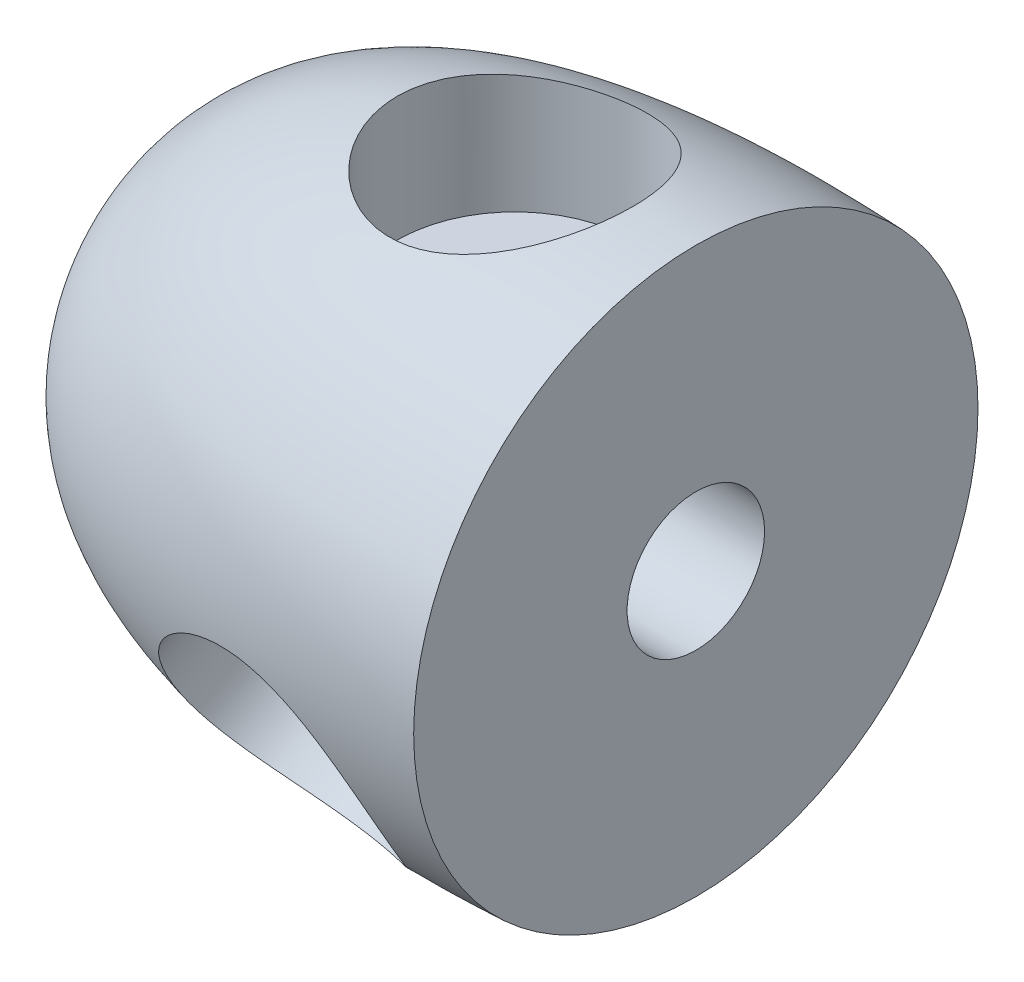
ISO-10303-21;
HEADER;
FILE_DESCRIPTION(('STEP AP214'),'2;1');
FILE_NAME('part.step','',(''),(''),'','','');
FILE_SCHEMA(('AUTOMOTIVE_DESIGN { 1 0 10303 214 1 1 1 1 }'));
ENDSEC;
DATA;
#1=APPLICATION_CONTEXT('core data for automotive mechanical design processes');
#2=APPLICATION_PROTOCOL_DEFINITION('international standard','automotive_design',2000,#1);
#3=PRODUCT_CONTEXT('',#1,'mechanical');
#4=PRODUCT('Part','Part','',(#3));
#5=PRODUCT_RELATED_PRODUCT_CATEGORY('part','',(#4));
#6=PRODUCT_DEFINITION_FORMATION('','',#4);
#7=PRODUCT_DEFINITION_CONTEXT('part definition',#1,'design');
#8=PRODUCT_DEFINITION('design','',#6,#7);
#9=PRODUCT_DEFINITION_SHAPE('','',#8);
#10=(LENGTH_UNIT() NAMED_UNIT(*) SI_UNIT(.MILLI.,.METRE.));
#11=(NAMED_UNIT(*) PLANE_ANGLE_UNIT() SI_UNIT($,.RADIAN.));
#12=(NAMED_UNIT(*) SI_UNIT($,.STERADIAN.) SOLID_ANGLE_UNIT());
#13=UNCERTAINTY_MEASURE_WITH_UNIT(LENGTH_MEASURE(1.E-05),#10,'distance_accuracy_value','');
#14=(GEOMETRIC_REPRESENTATION_CONTEXT(3) GLOBAL_UNCERTAINTY_ASSIGNED_CONTEXT((#13)) GLOBAL_UNIT_ASSIGNED_CONTEXT((#10,
#11,#12)) REPRESENTATION_CONTEXT('',''));
#15=CARTESIAN_POINT('',(0.,0.,0.));
#16=DIRECTION('',(0.,0.,1.));
#17=DIRECTION('',(1.,0.,0.));
#18=AXIS2_PLACEMENT_3D('',#15,#16,#17);
#19=CARTESIAN_POINT('',(38.1,19.812,0.));
#20=CARTESIAN_POINT('',(0.,21.4716402726946,0.));
#21=CARTESIAN_POINT('',(0.,0.,0.));
#22=B_SPLINE_CURVE_WITH_KNOTS('',2,(#19,#20,#21),.UNSPECIFIED.,.F.,.F.,(3,3),(0.,1.),.UNSPECIFIED.);
#23=CARTESIAN_POINT('',(0.,0.,0.));
#24=DIRECTION('',(-1.,0.,0.));
#25=AXIS1_PLACEMENT('',#23,#24);
#26=SURFACE_OF_REVOLUTION('',#22,#25);
#27=CARTESIAN_POINT('',(25.4,-1.76261734986766,-19.562942804273));
#28=CARTESIAN_POINT('',(25.177979042256,-1.75245092378135,-19.545334639338));
#29=CARTESIAN_POINT('',(24.9556856985046,-1.75155722758257,-19.5258587901368));
#30=CARTESIAN_POINT('',(24.5121644801844,-1.76840001050465,-19.4832226921928));
#31=CARTESIAN_POINT('',(24.2909365653041,-1.7861357791105,-19.4600625839937));
#32=CARTESIAN_POINT('',(23.851173876926,-1.8400757437532,-19.4100264242823));
#33=CARTESIAN_POINT('',(23.6326390650033,-1.8762796759748,-19.383150425855));
#34=CARTESIAN_POINT('',(23.1998549445183,-1.96675266852705,-19.3255712201423));
#35=CARTESIAN_POINT('',(22.9856056932079,-2.02102197002643,-19.2948679617673));
#36=CARTESIAN_POINT('',(22.563147708966,-2.14693709527098,-19.229488670206));
#37=CARTESIAN_POINT('',(22.3549330010919,-2.21856502450286,-19.1948167475011));
#38=CARTESIAN_POINT('',(21.9457548185982,-2.3784181937859,-19.1212410053601));
#39=CARTESIAN_POINT('',(21.7447913323496,-2.46664340721787,-19.0823371927112));
#40=CARTESIAN_POINT('',(21.3514508543389,-2.65873565988601,-19.0000256115136));
#41=CARTESIAN_POINT('',(21.1590738869654,-2.76260274354651,-18.9566178301732));
#42=CARTESIAN_POINT('',(20.7840716970498,-2.98494989831165,-18.8649909367234));
#43=CARTESIAN_POINT('',(20.6014500064428,-3.10343521130188,-18.8167700999125));
#44=CARTESIAN_POINT('',(20.2436390991279,-3.35633250972562,-18.7142271397298));
#45=CARTESIAN_POINT('',(20.0686699358216,-3.49101438272354,-18.6598027458739));
#46=CARTESIAN_POINT('',(19.7312350472181,-3.77307197207505,-18.5453681739561));
#47=CARTESIAN_POINT('',(19.5687696000923,-3.92044797068136,-18.4853578716896));
#48=CARTESIAN_POINT('',(19.2573255038571,-4.22660350531439,-18.3594863967184));
#49=CARTESIAN_POINT('',(19.1083504494912,-4.3853860607164,-18.293623673746));
#50=CARTESIAN_POINT('',(18.8249304290291,-4.71289597032143,-18.1558957268127));
#51=CARTESIAN_POINT('',(18.6904807401799,-4.88162006440834,-18.084032467411));
#52=CARTESIAN_POINT('',(18.433189915827,-5.23276429722652,-17.9319635837839));
#53=CARTESIAN_POINT('',(18.3108076146885,-5.4154415176934,-17.8515745296494));
#54=CARTESIAN_POINT('',(18.0831804365436,-5.78834152211271,-17.6842810555326));
#55=CARTESIAN_POINT('',(17.9779359169472,-5.97856446332896,-17.5973764997241));
#56=CARTESIAN_POINT('',(17.7853708906434,-6.36494915577863,-17.4171651267974));
#57=CARTESIAN_POINT('',(17.6980495891138,-6.56111064321866,-17.3238585938259));
#58=CARTESIAN_POINT('',(17.5420014283773,-6.95775535589853,-17.1310852675636));
#59=CARTESIAN_POINT('',(17.4732742688919,-7.1582385112909,-17.0316185737856));
#60=CARTESIAN_POINT('',(17.3555004393737,-7.56006128711307,-16.8278407979884));
#61=CARTESIAN_POINT('',(17.3062810933601,-7.76137668863923,-16.7235817750804));
#62=CARTESIAN_POINT('',(17.2270409904684,-8.16505394391144,-16.5099163007125));
#63=CARTESIAN_POINT('',(17.1970201622881,-8.36741579376823,-16.4005098683715));
#64=CARTESIAN_POINT('',(17.1564287140397,-8.7715938667887,-16.1772225670535));
#65=CARTESIAN_POINT('',(17.1458560490923,-8.97341014508818,-16.0633421697782));
#66=CARTESIAN_POINT('',(17.1442438498728,-9.37499195420002,-15.831890321555));
#67=CARTESIAN_POINT('',(17.1532040708587,-9.57475751067589,-15.7143189168727));
#68=CARTESIAN_POINT('',(17.1902286178592,-9.96704836192916,-15.4786429635141));
#69=CARTESIAN_POINT('',(17.2179298451381,-10.1596391573758,-15.3605901899593));
#70=CARTESIAN_POINT('',(17.2918396297032,-10.5401535796863,-15.1227764963873));
#71=CARTESIAN_POINT('',(17.3380479272483,-10.7280772720121,-15.003015600366));
#72=CARTESIAN_POINT('',(17.448610461299,-11.0980732117455,-14.7628293578434));
#73=CARTESIAN_POINT('',(17.5129650804278,-11.2801453356801,-14.6424039973841));
#74=CARTESIAN_POINT('',(17.6593300820117,-11.6373588381103,-14.4020059699722));
#75=CARTESIAN_POINT('',(17.7413406567789,-11.8125001410895,-14.282033307965));
#76=CARTESIAN_POINT('',(17.9229253698379,-12.155856560836,-14.0430403485334));
#77=CARTESIAN_POINT('',(18.0225958773169,-12.3240270858483,-13.9240292275634));
#78=CARTESIAN_POINT('',(18.2385107562761,-12.6515923632142,-13.6888399535874));
#79=CARTESIAN_POINT('',(18.3547612961594,-12.8109838186892,-13.572662873875));
#80=CARTESIAN_POINT('',(18.6029780816215,-13.1201418189478,-13.3444844017514));
#81=CARTESIAN_POINT('',(18.7349402946533,-13.269910818296,-13.2324819475324));
#82=CARTESIAN_POINT('',(19.0137923162863,-13.559296126781,-13.013861180692));
#83=CARTESIAN_POINT('',(19.1606889887665,-13.6989077165382,-12.9072453777809));
#84=CARTESIAN_POINT('',(19.4716117899571,-13.9701461779061,-12.6986089598378));
#85=CARTESIAN_POINT('',(19.635930507394,-14.1015467542589,-12.5967299276016));
#86=CARTESIAN_POINT('',(19.9779103809167,-14.3525576926407,-12.4014309229773));
#87=CARTESIAN_POINT('',(20.1555654803069,-14.472173350376,-12.3080071526578));
#88=CARTESIAN_POINT('',(20.5231792840938,-14.6992977765283,-12.1308956280198));
#89=CARTESIAN_POINT('',(20.7131432199534,-14.8068013432306,-12.0472120562656));
#90=CARTESIAN_POINT('',(21.1039350474311,-15.0092225760039,-11.890983926701));
#91=CARTESIAN_POINT('',(21.3047584172584,-15.1041454246353,-11.818434780165));
#92=CARTESIAN_POINT('',(21.7148381268812,-15.280657934292,-11.6860293185806));
#93=CARTESIAN_POINT('',(21.9240439281536,-15.3623158312335,-11.6261075407514));
#94=CARTESIAN_POINT('',(22.3503722968931,-15.5126291606077,-11.5195713736177));
#95=CARTESIAN_POINT('',(22.567494848128,-15.5812846196979,-11.4729569570303));
#96=CARTESIAN_POINT('',(23.0079578599879,-15.7053459703705,-11.3939731704966));
#97=CARTESIAN_POINT('',(23.2312964419457,-15.7607558176464,-11.3615995452217));
#98=CARTESIAN_POINT('',(23.6825128764926,-15.8581767555394,-11.3117796573715));
#99=CARTESIAN_POINT('',(23.9103905747733,-15.9001883008125,-11.2943328882366));
#100=CARTESIAN_POINT('',(24.3602849287699,-15.969378814711,-11.2751640268113));
#101=CARTESIAN_POINT('',(24.5822015136917,-15.9970543084529,-11.272877555943));
#102=CARTESIAN_POINT('',(25.0269222093978,-16.03984008856,-11.2826619023484));
#103=CARTESIAN_POINT('',(25.249726295955,-16.0549507155909,-11.2947323303484));
#104=CARTESIAN_POINT('',(25.6945974094742,-16.072611774355,-11.3330998688252));
#105=CARTESIAN_POINT('',(25.9166644487962,-16.0751624177903,-11.3593967395031));
#106=CARTESIAN_POINT('',(26.3585024155309,-16.0677551351911,-11.4258396994693));
#107=CARTESIAN_POINT('',(26.5782733196919,-16.0577970826115,-11.4659859288626));
#108=CARTESIAN_POINT('',(27.0127583032502,-16.025554424412,-11.5592555161112));
#109=CARTESIAN_POINT('',(27.227494527572,-16.0033426897499,-11.6123011301262));
#110=CARTESIAN_POINT('',(27.6518910424277,-15.9467551533038,-11.7307222844201));
#111=CARTESIAN_POINT('',(27.8615513783628,-15.9123794603629,-11.7960977143691));
#112=CARTESIAN_POINT('',(28.2745902648246,-15.8315799969881,-11.9382886679161));
#113=CARTESIAN_POINT('',(28.4779686133428,-15.7851558395647,-12.0151045589409));
#114=CARTESIAN_POINT('',(28.8773435818745,-15.6803889158321,-12.1791757898933));
#115=CARTESIAN_POINT('',(29.0733373073107,-15.622041532329,-12.2664351685556));
#116=CARTESIAN_POINT('',(29.6686586756022,-15.4225744743676,-12.5519071231717));
#117=CARTESIAN_POINT('',(30.0537727731701,-15.2611515664173,-12.7663251755798));
#118=CARTESIAN_POINT('',(30.7778849195124,-14.8871033316191,-13.2263520264475));
#119=CARTESIAN_POINT('',(31.1168675945177,-14.674461000451,-13.4719711705222));
#120=CARTESIAN_POINT('',(31.5912576772834,-14.3134397945528,-13.8608806369056));
#121=CARTESIAN_POINT('',(31.746537358285,-14.1829105717422,-13.9969810404419));
#122=CARTESIAN_POINT('',(32.041206730943,-13.908752795553,-14.2730742939618));
#123=CARTESIAN_POINT('',(32.1806026437289,-13.7651294106615,-14.4130655931054));
#124=CARTESIAN_POINT('',(32.4424224027067,-13.4652200588828,-14.6953613343857));
#125=CARTESIAN_POINT('',(32.56484500124,-13.3089331624744,-14.8376659457091));
#126=CARTESIAN_POINT('',(32.7916304557357,-12.9843296915883,-15.1229565200745));
#127=CARTESIAN_POINT('',(32.8959941747846,-12.81601369256,-15.2659424502184));
#128=CARTESIAN_POINT('',(33.0826495991738,-12.4736661580074,-15.5464666145238));
#129=CARTESIAN_POINT('',(33.1655330701112,-12.2999817282643,-15.6840345613557));
#130=CARTESIAN_POINT('',(33.3125654443824,-11.9430707016097,-15.9568012978342));
#131=CARTESIAN_POINT('',(33.3767146195439,-11.759844243195,-16.0920001218291));
#132=CARTESIAN_POINT('',(33.4855534247756,-11.3851141497414,-16.3585359083));
#133=CARTESIAN_POINT('',(33.5302515655465,-11.193614175138,-16.4898745362814));
#134=CARTESIAN_POINT('',(33.5997085881312,-10.8036612026647,-16.747396912131));
#135=CARTESIAN_POINT('',(33.6244686585947,-10.6052086200254,-16.873580966874));
#136=CARTESIAN_POINT('',(33.6527626580679,-10.2165937400664,-17.1112199020232));
#137=CARTESIAN_POINT('',(33.6576228200599,-10.0267825740606,-17.2230932497639));
#138=CARTESIAN_POINT('',(33.6497153600493,-9.6438984767207,-17.4404379120301));
#139=CARTESIAN_POINT('',(33.6369486318703,-9.45082571126596,-17.5459095508901));
#140=CARTESIAN_POINT('',(33.5939255781888,-9.06290786367979,-17.7497324366376));
#141=CARTESIAN_POINT('',(33.5636709171288,-8.8680629519521,-17.8480843601535));
#142=CARTESIAN_POINT('',(33.4859859329276,-8.47808832665189,-18.037136481541));
#143=CARTESIAN_POINT('',(33.4385554952877,-8.28295861118943,-18.1278366283988));
#144=CARTESIAN_POINT('',(33.328033612239,-7.89756332745035,-18.2995894485187));
#145=CARTESIAN_POINT('',(33.2652516357638,-7.70727503762213,-18.3807908205454));
#146=CARTESIAN_POINT('',(33.1241400998997,-7.32919564673703,-18.5353002889781));
#147=CARTESIAN_POINT('',(33.0458050283002,-7.14140545628733,-18.6086055726629));
#148=CARTESIAN_POINT('',(32.8742735995475,-6.76976837926926,-18.7472229391074));
#149=CARTESIAN_POINT('',(32.7810805704607,-6.5859206200649,-18.8125368061051));
#150=CARTESIAN_POINT('',(32.5804973053079,-6.22332504512482,-18.9352890823606));
#151=CARTESIAN_POINT('',(32.4731015907962,-6.04457922989086,-18.9927244351094));
#152=CARTESIAN_POINT('',(32.2392034402904,-5.68471207620167,-19.1025406150834));
#153=CARTESIAN_POINT('',(32.1120158789283,-5.50391565331918,-19.1545273409411));
#154=CARTESIAN_POINT('',(31.8436835347237,-5.15058556003674,-19.2503166389402));
#155=CARTESIAN_POINT('',(31.7025325140508,-4.97805563404017,-19.2941155278906));
#156=CARTESIAN_POINT('',(31.4071992012736,-4.64256748168071,-19.3738924915253));
#157=CARTESIAN_POINT('',(31.2530150278201,-4.47961064297724,-19.4098694344168));
#158=CARTESIAN_POINT('',(30.9325398519229,-4.16449239836816,-19.4744325708079));
#159=CARTESIAN_POINT('',(30.7662484154701,-4.01233137984678,-19.5030184991945));
#160=CARTESIAN_POINT('',(30.4115982239453,-3.71071485645264,-19.5548577279195));
#161=CARTESIAN_POINT('',(30.2225089624541,-3.56203937123997,-19.5776593119737));
#162=CARTESIAN_POINT('',(29.8328953705201,-3.2796221870867,-19.6160077441674));
#163=CARTESIAN_POINT('',(29.6323750104448,-3.14587535014364,-19.6315570942059));
#164=CARTESIAN_POINT('',(29.2209576801007,-2.8945291318709,-19.6559923835115));
#165=CARTESIAN_POINT('',(29.0100567912014,-2.77693591299748,-19.6648757855164));
#166=CARTESIAN_POINT('',(28.579334549032,-2.55928440232588,-19.6765172848787));
#167=CARTESIAN_POINT('',(28.3595171064493,-2.45921852351176,-19.6792780385968));
#168=CARTESIAN_POINT('',(27.9181892304072,-2.28015592170019,-19.6791899384302));
#169=CARTESIAN_POINT('',(27.6968758266825,-2.2006737481342,-19.6764868965596));
#170=CARTESIAN_POINT('',(27.2484993003996,-2.0604223245347,-19.6661735177426));
#171=CARTESIAN_POINT('',(27.0214362523287,-1.99965283221044,-19.6585632443388));
#172=CARTESIAN_POINT('',(26.5632454938914,-1.89770122524741,-19.6387810444158));
#173=CARTESIAN_POINT('',(26.3321195937261,-1.85651060569079,-19.6266111026989));
#174=CARTESIAN_POINT('',(25.8674297983361,-1.79432352451245,-19.59796567658));
#175=CARTESIAN_POINT('',(25.6338660119059,-1.77332616559523,-19.5814903835295));
#176=CARTESIAN_POINT('',(25.4,-1.76261734986766,-19.562942804273));
#177=B_SPLINE_CURVE_WITH_KNOTS('',3,(#27,#28,#29,#30,#31,#32,#33,#34,#35,#36,#37,#38,#39,#40,
#41,#42,#43,#44,#45,#46,#47,#48,#49,#50,#51,#52,#53,#54,#55,#56,#57,#58,#59,#60,#61,#62,#63,#64,
#65,#66,#67,#68,#69,#70,#71,#72,#73,#74,#75,#76,#77,#78,#79,#80,#81,#82,#83,#84,#85,#86,#87,#88,
#89,#90,#91,#92,#93,#94,#95,#96,#97,#98,#99,#100,#101,#102,#103,#104,#105,#106,#107,#108,#109,
#110,#111,#112,#113,#114,#115,#116,#117,#118,#119,#120,#121,#122,#123,#124,#125,#126,#127,#128,
#129,#130,#131,#132,#133,#134,#135,#136,#137,#138,#139,#140,#141,#142,#143,#144,#145,#146,#147,
#148,#149,#150,#151,#152,#153,#154,#155,#156,#157,#158,#159,#160,#161,#162,#163,#164,#165,#166,
#167,#168,#169,#170,#171,#172,#173,#174,#175,#176),.UNSPECIFIED.,.T.,.F.,(4,2,2,2,2,2,2,2,2,2,2,
2,2,2,2,2,2,2,2,2,2,2,2,2,2,2,2,2,2,2,2,2,2,2,2,2,2,2,2,2,2,2,2,2,2,2,2,2,2,2,2,2,2,2,2,2,2,2,2,
2,2,2,2,2,2,2,2,2,2,2,2,2,2,2,4),(0.,0.668639836207739,1.33725417187646,2.00585895674656,
2.67447266770232,3.34240003408516,4.01032632923638,4.67825452139495,5.3464229228862,
6.02788001843236,6.70935227002809,7.39100558035394,8.0724365877904,8.77394808707399,
9.47547421456755,10.176969225488,10.8784529072241,11.5735806856533,12.2687058824,
12.9637579859505,13.6588013807287,14.3407502649867,15.0226895786327,15.7046432723447,
16.3866043944047,17.072408474239,17.7584683680944,18.4443525563447,19.1305534144538,
19.8310178740593,20.5311661213272,21.2316139204666,21.9317722709881,22.628206352774,
23.3246390067136,24.0208634161743,24.7170641975443,25.3871942603012,26.0573061535259,
26.7274067517917,27.3975141292406,28.0636787694936,28.7298374490527,29.3960175278793,
30.0624560712645,31.4641017977987,32.8662134991787,33.5982952260125,34.3300892286367,
35.0619369948048,35.7937497741719,36.5025079922646,37.211255926024,37.9196934381761,
38.6280887122165,39.2884183636771,39.9487145324002,40.6089478667041,41.2691856023982,
41.9170760540844,42.5651965374249,43.2131720502784,43.8613982417635,44.5419027300032,
45.2227126015004,45.9036209169858,46.5845536530228,47.3085605410606,48.0323174738,
48.7563497508658,49.4800678391665,50.1847271202849,50.8893772771315,51.5937210587795,
52.2980335411878),.UNSPECIFIED.);
#178=CARTESIAN_POINT('',(25.4,-1.76261734986766,-19.562942804273));
#179=VERTEX_POINT('',#178);
#180=EDGE_CURVE('E39',#179,#179,#177,.T.);
#181=ORIENTED_EDGE('',*,*,#180,.T.);
#182=EDGE_LOOP('',(#181));
#183=FACE_BOUND('',#182,.T.);
#184=CARTESIAN_POINT('',(25.4,-16.0606967663486,11.3079428042732));
#185=CARTESIAN_POINT('',(25.177979042256,-16.0505308612439,11.2903343385492));
#186=CARTESIAN_POINT('',(24.9556856985046,-16.0341111291748,11.2798224503372));
#187=CARTESIAN_POINT('',(24.5121644801844,-15.988765793776,11.2730906792462));
#188=CARTESIAN_POINT('',(24.2909365653041,-15.9598406674183,11.2768702513149));
#189=CARTESIAN_POINT('',(23.851173876926,-15.889538099679,11.298565551119));
#190=CARTESIAN_POINT('',(23.6326390650033,-15.8481608361781,11.3164810769262));
#191=CARTESIAN_POINT('',(23.1998549445184,-15.7530592850251,11.3660433839765));
#192=CARTESIAN_POINT('',(22.9856056932079,-15.6993348325437,11.3976903485331));
#193=CARTESIAN_POINT('',(22.563147708966,-15.5797571425479,11.4740463999349));
#194=CARTESIAN_POINT('',(22.3549330010919,-15.5139164120714,11.5187420449177));
#195=CARTESIAN_POINT('',(21.9457548185982,-15.3702713656335,11.6203910793218));
#196=CARTESIAN_POINT('',(21.7447913323496,-15.2924670688596,11.6773444490838));
#197=CARTESIAN_POINT('',(21.3514508543389,-15.1251370221827,11.8025454291657));
#198=CARTESIAN_POINT('',(21.1590738869654,-15.0356112389897,11.8707930715626));
#199=CARTESIAN_POINT('',(20.7840716970498,-14.8450864442097,12.0175379093234));
#200=CARTESIAN_POINT('',(20.6014500064428,-14.7440833180447,12.0960387819429));
#201=CARTESIAN_POINT('',(20.2436390991279,-14.5288298603353,12.2637827868349));
#202=CARTESIAN_POINT('',(20.0686699358216,-14.4143560161716,12.3532085133524));
#203=CARTESIAN_POINT('',(19.7312350472181,-14.1742239751438,12.5402602651021));
#204=CARTESIAN_POINT('',(19.5687696000923,-14.0485655295891,12.6378864726701));
#205=CARTESIAN_POINT('',(19.2573255038571,-13.7864798673357,12.8400892056859));
#206=CARTESIAN_POINT('',(19.1083504494912,-13.6500497983782,12.9446675708556));
#207=CARTESIAN_POINT('',(18.8249304290291,-13.3670189427204,13.1594354990981));
#208=CARTESIAN_POINT('',(18.6904807401799,-13.2204214874363,13.269623221107));
#209=CARTESIAN_POINT('',(18.4331899158271,-12.913153854681,13.4976886053064));
#210=CARTESIAN_POINT('',(18.3108076146885,-12.7521962813809,13.6156971918562));
#211=CARTESIAN_POINT('',(18.0831804365436,-12.4208658806987,13.8549913316962));
#212=CARTESIAN_POINT('',(17.9779359169472,-12.2504928570558,13.9762769532679));
#213=CARTESIAN_POINT('',(17.7853708906434,-11.9012328838256,14.2207902260994));
#214=CARTESIAN_POINT('',(17.6980495891138,-11.7223463122132,14.3440177909808));
#215=CARTESIAN_POINT('',(17.5420014283773,-11.357077358158,14.5911355253072));
#216=CARTESIAN_POINT('',(17.4732742688919,-11.1706950968197,14.7150256840189));
#217=CARTESIAN_POINT('',(17.3555004393737,-10.7933069783415,14.9611255278014));
#218=CARTESIAN_POINT('',(17.3062810933601,-10.6023583151664,15.0833402682422));
#219=CARTESIAN_POINT('',(17.2270409904684,-10.2154799588161,15.3261022890539));
#220=CARTESIAN_POINT('',(17.1970201622881,-10.0195502841429,15.4466495756162));
#221=CARTESIAN_POINT('',(17.1564287140397,-9.62408877234878,15.6850344038456));
#222=CARTESIAN_POINT('',(17.1458560490923,-9.4245573161656,15.8028722291125));
#223=CARTESIAN_POINT('',(17.1442438498728,-9.02332323129554,16.0349263533895));
#224=CARTESIAN_POINT('',(17.1532040708587,-8.82162062984407,16.1491426977575));
#225=CARTESIAN_POINT('',(17.1902286178592,-8.42137384154784,16.3710385639358));
#226=CARTESIAN_POINT('',(17.2179298451381,-8.22284174293875,16.4788006985503));
#227=CARTESIAN_POINT('',(17.2918396297032,-7.82663183178245,16.6894290079915));
#228=CARTESIAN_POINT('',(17.3380479272483,-7.6289540072851,16.792295251508));
#229=CARTESIAN_POINT('',(17.448610461299,-7.23594864975427,16.9926280133529));
#230=CARTESIAN_POINT('',(17.5129650804278,-7.04062116636932,17.0900944177716));
#231=CARTESIAN_POINT('',(17.6593300820117,-6.65382361639583,17.279251371745));
#232=CARTESIAN_POINT('',(17.7413406567789,-6.46235359184833,17.3709418583733));
#233=CARTESIAN_POINT('',(17.9229253698379,-6.08370140778169,17.5488007607105));
#234=CARTESIAN_POINT('',(18.0225958773169,-5.8965494911827,17.6349351470539));
#235=CARTESIAN_POINT('',(18.2385107562761,-5.52908696653885,17.8010203616625));
#236=CARTESIAN_POINT('',(18.3547612961594,-5.34877893643296,17.8809688713937));
#237=CARTESIAN_POINT('',(18.6029780816215,-4.99659158284788,18.0346183173391));
#238=CARTESIAN_POINT('',(18.7349402946533,-4.82471011253396,18.1083208483645));
#239=CARTESIAN_POINT('',(19.0137923162863,-4.49068632041278,18.2496254935743));
#240=CARTESIAN_POINT('',(19.1606889887665,-4.3285485317684,18.3172247755112));
#241=CARTESIAN_POINT('',(19.4716117899571,-4.01224486299105,18.4478059645677));
#242=CARTESIAN_POINT('',(19.635930507394,-3.85831474478514,18.510662685643));
#243=CARTESIAN_POINT('',(19.9779103809167,-3.5636753762558,18.6303950325973));
#244=CARTESIAN_POINT('',(20.1555654803069,-3.42296018897413,18.6872733457267));
#245=CARTESIAN_POINT('',(20.5231792840938,-3.15601489625851,18.7954131062756));
#246=CARTESIAN_POINT('',(20.7131432199534,-3.02979101388877,18.8466721401601));
#247=CARTESIAN_POINT('',(21.1039350474311,-2.79328286851348,18.9438600052248));
#248=CARTESIAN_POINT('',(21.3047584172584,-2.68299204027468,18.9897910302712));
#249=CARTESIAN_POINT('',(21.7148381268812,-2.48006929211447,19.0764526169274));
#250=CARTESIAN_POINT('',(21.9240439281536,-2.38734656180367,19.1172095411838));
#251=CARTESIAN_POINT('',(22.3503722968931,-2.21992686995698,19.1941166193824));
#252=CARTESIAN_POINT('',(22.567494848128,-2.1452298714646,19.2302667827693));
#253=CARTESIAN_POINT('',(23.0079578599879,-2.01479723050302,19.2982151708127));
#254=CARTESIAN_POINT('',(23.2312964419457,-1.95905592496445,19.3300146935361));
#255=CARTESIAN_POINT('',(23.6825128764926,-1.86720016752595,19.3894737566868));
#256=CARTESIAN_POINT('',(23.9103905747733,-1.83108504960459,19.417133437578));
#257=CARTESIAN_POINT('',(24.3602849287699,-1.77988907169947,19.4674697496024));
#258=CARTESIAN_POINT('',(24.5822015136917,-1.76407118297153,19.490294194811));
#259=CARTESIAN_POINT('',(25.0269222093978,-1.75115178546451,19.5322399405072));
#260=CARTESIAN_POINT('',(25.249726295955,-1.75404976923159,19.5513613413831));
#261=CARTESIAN_POINT('',(25.6945974094742,-1.7784465028511,19.5858400361689));
#262=CARTESIAN_POINT('',(25.9166644487962,-1.79994493918062,19.6011973935188));
#263=CARTESIAN_POINT('',(26.3585024155309,-1.86118987171348,19.628003978598));
#264=CARTESIAN_POINT('',(26.5782733196919,-1.90093655252413,19.6394531667885));
#265=CARTESIAN_POINT('',(27.0127583032502,-1.99783171358164,19.6581649993265));
#266=CARTESIAN_POINT('',(27.227494527572,-2.054876430209,19.6654518798546));
#267=CARTESIAN_POINT('',(27.6518910424277,-2.18572592639599,19.6756562129015));
#268=CARTESIAN_POINT('',(27.8615513783628,-2.25953055598571,19.6785737045165));
#269=CARTESIAN_POINT('',(28.2745902648246,-2.42307126563306,19.6796947933953));
#270=CARTESIAN_POINT('',(28.4779686133427,-2.51280785738655,19.6778982392298));
#271=CARTESIAN_POINT('',(28.8773435818745,-2.70728117328787,19.6692030372772));
#272=CARTESIAN_POINT('',(29.0733373073107,-2.81202370367942,19.6623024102503));
#273=CARTESIAN_POINT('',(29.6686586756022,-3.15898319742562,19.6322948481456));
#274=CARTESIAN_POINT('',(30.0537727731701,-3.42538613181618,19.5997075353119));
#275=CARTESIAN_POINT('',(30.7778849195124,-4.01080518848969,19.5057856871699));
#276=CARTESIAN_POINT('',(31.1168675945177,-4.32983877249816,19.4444415984957));
#277=CARTESIAN_POINT('',(31.5912576772834,-4.84715485310758,19.3262427960747));
#278=CARTESIAN_POINT('',(31.746537358285,-5.03028587144064,19.2812513749527));
#279=CARTESIAN_POINT('',(32.041206730943,-5.40646853089696,19.1818704028877));
#280=CARTESIAN_POINT('',(32.1806026437289,-5.59951624470984,19.1274845525659));
#281=CARTESIAN_POINT('',(32.4424224027067,-5.99394620392811,19.0089033057332));
#282=CARTESIAN_POINT('',(32.56484500124,-6.19532906061403,18.9447071888266));
#283=CARTESIAN_POINT('',(32.7916304557357,-6.60469968091774,18.8062376240653));
#284=CARTESIAN_POINT('',(32.8959941747846,-6.81268712832032,18.7319646581154));
#285=CARTESIAN_POINT('',(33.0826495991738,-7.22680194826047,18.5757450784226));
#286=CARTESIAN_POINT('',(33.1655330701112,-7.4327814998349,18.4941139234392));
#287=CARTESIAN_POINT('',(33.3125654443824,-7.84745993625995,18.3214032757047));
#288=CARTESIAN_POINT('',(33.3767146195439,-8.05615878160871,18.2303239200696));
#289=CARTESIAN_POINT('',(33.4855534247756,-8.47435059043691,18.0390660328118));
#290=CARTESIAN_POINT('',(33.5302515655465,-8.68384316606874,17.9388915039718));
#291=CARTESIAN_POINT('',(33.5997085881312,-9.10184057183407,17.7299435114535));
#292=CARTESIAN_POINT('',(33.6244686585947,-9.31034546011376,17.6211705608127));
#293=CARTESIAN_POINT('',(33.6527626580679,-9.71045425486072,17.4034396700542));
#294=CARTESIAN_POINT('',(33.6576228200599,-9.90224499901345,17.2949950522416));
#295=CARTESIAN_POINT('',(33.6497153600493,-10.2819130465829,17.0720800283733));
#296=CARTESIAN_POINT('',(33.6369486318703,-10.4697905479417,16.9576099281405));
#297=CARTESIAN_POINT('',(33.5939255781888,-10.8402652686649,16.7235746604233));
#298=CARTESIAN_POINT('',(33.5636709171288,-11.0228629888045,16.6040099788269));
#299=CARTESIAN_POINT('',(33.4859859329276,-11.3815742412156,16.3608081071794));
#300=CARTESIAN_POINT('',(33.4385554952877,-11.5576877302526,16.2371708899845));
#301=CARTESIAN_POINT('',(33.328033612239,-11.8991276775176,15.9892851938278));
#302=CARTESIAN_POINT('',(33.2652516357638,-12.064594273429,15.8650913868072));
#303=CARTESIAN_POINT('',(33.1241400998997,-12.3874430936595,15.6149197638697));
#304=CARTESIAN_POINT('',(33.0458050283002,-12.544822426787,15.4889413302011));
#305=CARTESIAN_POINT('',(32.8742735995475,-12.8506871260427,15.2364028637375));
#306=CARTESIAN_POINT('',(32.7810805704607,-12.9991744736842,15.1098429673366));
#307=CARTESIAN_POINT('',(32.5804973053079,-13.2867788507639,14.8572021262664));
#308=CARTESIAN_POINT('',(32.4731015907962,-13.4258922329367,14.731121385828));
#309=CARTESIAN_POINT('',(32.2392034402904,-13.7009294113853,14.4743753787326));
#310=CARTESIAN_POINT('',(32.1120158789283,-13.8363494480789,14.3437944465319));
#311=CARTESIAN_POINT('',(31.8436835347237,-14.0959704601981,14.0856962588273));
#312=CARTESIAN_POINT('',(31.7025325140508,-14.220166373685,13.9581804044764));
#313=CARTESIAN_POINT('',(31.4071992012736,-14.4569993270091,13.7075276236817));
#314=CARTESIAN_POINT('',(31.2530150278201,-14.5696346928554,13.5843913330899));
#315=CARTESIAN_POINT('',(30.9325398519229,-14.7831071314226,13.3437724962581));
#316=CARTESIAN_POINT('',(30.7662484154701,-14.8839437808568,13.2262901529461));
#317=CARTESIAN_POINT('',(30.4115982239453,-15.0796461315424,12.9910021958481));
#318=CARTESIAN_POINT('',(30.2225089624541,-15.1737306251861,12.8736462407611));
#319=CARTESIAN_POINT('',(29.8328953705201,-15.3481499337379,12.648240000916));
#320=CARTESIAN_POINT('',(29.6323750104448,-15.4284894843551,12.5401865174667));
#321=CARTESIAN_POINT('',(29.2209576801007,-15.5753241747789,12.3347319519502));
#322=CARTESIAN_POINT('',(29.0100567912014,-15.6418140360238,12.2373349380954));
#323=CARTESIAN_POINT('',(28.579334549032,-15.7607216255456,12.0546639503629));
#324=CARTESIAN_POINT('',(28.3595171064493,-15.8131454478061,11.9693847341169));
#325=CARTESIAN_POINT('',(27.9181892304072,-15.9026004517295,11.814267921997));
#326=CARTESIAN_POINT('',(27.6968758266825,-15.9400006355851,11.7440828196056));
#327=CARTESIAN_POINT('',(27.2484993003996,-16.0011946993305,11.617464834443));
#328=CARTESIAN_POINT('',(27.0214362523287,-16.0249887553951,11.5610317736132));
#329=CARTESIAN_POINT('',(26.5632454938914,-16.0588326712006,11.4628479920651));
#330=CARTESIAN_POINT('',(26.3321195937261,-16.0688885022895,11.421090898273));
#331=CARTESIAN_POINT('',(25.8674297983361,-16.0751743761575,11.3529125931259));
#332=CARTESIAN_POINT('',(25.6338660119059,-16.0714050332995,11.3264907003659));
#333=CARTESIAN_POINT('',(25.4,-16.0606967663486,11.3079428042732));
#334=B_SPLINE_CURVE_WITH_KNOTS('',3,(#184,#185,#186,#187,#188,#189,#190,#191,#192,#193,#194,
#195,#196,#197,#198,#199,#200,#201,#202,#203,#204,#205,#206,#207,#208,#209,#210,#211,#212,#213,
#214,#215,#216,#217,#218,#219,#220,#221,#222,#223,#224,#225,#226,#227,#228,#229,#230,#231,#232,
#233,#234,#235,#236,#237,#238,#239,#240,#241,#242,#243,#244,#245,#246,#247,#248,#249,#250,#251,
#252,#253,#254,#255,#256,#257,#258,#259,#260,#261,#262,#263,#264,#265,#266,#267,#268,#269,#270,
#271,#272,#273,#274,#275,#276,#277,#278,#279,#280,#281,#282,#283,#284,#285,#286,#287,#288,#289,
#290,#291,#292,#293,#294,#295,#296,#297,#298,#299,#300,#301,#302,#303,#304,#305,#306,#307,#308,
#309,#310,#311,#312,#313,#314,#315,#316,#317,#318,#319,#320,#321,#322,#323,#324,#325,#326,#327,
#328,#329,#330,#331,#332,#333),.UNSPECIFIED.,.T.,.F.,(4,2,2,2,2,2,2,2,2,2,2,2,2,2,2,2,2,2,2,2,2,
2,2,2,2,2,2,2,2,2,2,2,2,2,2,2,2,2,2,2,2,2,2,2,2,2,2,2,2,2,2,2,2,2,2,2,2,2,2,2,2,2,2,2,2,2,2,2,2,
2,2,2,2,2,4),(0.,0.668639836207739,1.33725417187645,2.00585895674656,2.67447266770232,
3.34240003408516,4.01032632923639,4.67825452139496,5.3464229228862,6.02788001843236,
6.70935227002809,7.39100558035394,8.0724365877904,8.77394808707399,9.47547421456755,
10.1769692254879,10.8784529072241,11.5735806856533,12.2687058824,12.9637579859505,
13.6588013807287,14.3407502649867,15.0226895786327,15.7046432723447,16.3866043944047,
17.072408474239,17.7584683680944,18.4443525563447,19.1305534144538,19.8310178740593,
20.5311661213272,21.2316139204666,21.9317722709881,22.628206352774,23.3246390067136,
24.0208634161743,24.7170641975443,25.3871942603012,26.0573061535259,26.7274067517917,
27.3975141292406,28.0636787694936,28.7298374490527,29.3960175278793,30.0624560712644,
31.4641017977987,32.8662134991787,33.5982952260125,34.3300892286367,35.0619369948048,
35.7937497741719,36.5025079922646,37.211255926024,37.9196934381761,38.6280887122165,
39.2884183636771,39.9487145324002,40.6089478667041,41.2691856023982,41.9170760540844,
42.5651965374249,43.2131720502784,43.8613982417635,44.5419027300032,45.2227126015004,
45.9036209169857,46.5845536530228,47.3085605410605,48.0323174738,48.7563497508658,
49.4800678391665,50.1847271202849,50.8893772771314,51.5937210587795,52.2980335411878),.UNSPECIFIED.);
#335=CARTESIAN_POINT('',(25.4,-16.0606967663486,11.3079428042732));
#336=VERTEX_POINT('',#335);
#337=EDGE_CURVE('E86',#336,#336,#334,.T.);
#338=ORIENTED_EDGE('',*,*,#337,.T.);
#339=EDGE_LOOP('',(#338));
#340=FACE_BOUND('',#339,.T.);
#341=CARTESIAN_POINT('',(33.655,19.927960859124,0.));
#342=CARTESIAN_POINT('',(33.6549997767301,19.9279606999014,0.221530507732043));
#343=CARTESIAN_POINT('',(33.6460742521877,19.9243264044874,0.443064717849642));
#344=CARTESIAN_POINT('',(33.6104674080911,19.9098750024314,0.884465539299076));
#345=CARTESIAN_POINT('',(33.5837857153791,19.8990577448347,1.10433211548626));
#346=CARTESIAN_POINT('',(33.5129405365032,19.8704916785409,1.54081693019501));
#347=CARTESIAN_POINT('',(33.4687733521915,19.8527414035347,1.75743447148662));
#348=CARTESIAN_POINT('',(33.3634050401851,19.8107184330152,2.18583270117959));
#349=CARTESIAN_POINT('',(33.3022039020567,19.7864457335068,2.39761338661819));
#350=CARTESIAN_POINT('',(33.1635125377324,19.7319846240849,2.81443310869648));
#351=CARTESIAN_POINT('',(33.0860599612573,19.7018098981719,3.01948648243517));
#352=CARTESIAN_POINT('',(32.9154673951993,19.6361609320626,3.42207125082346));
#353=CARTESIAN_POINT('',(32.8223274423304,19.6006867042689,3.61960266307577));
#354=CARTESIAN_POINT('',(32.6211222174708,19.5251791283462,4.00597810567829));
#355=CARTESIAN_POINT('',(32.5130578118569,19.485146044886,4.19482263946119));
#356=CARTESIAN_POINT('',(32.2827564350196,19.4013069542923,4.56287589251674));
#357=CARTESIAN_POINT('',(32.1605139537537,19.3574994820258,4.74208082566895));
#358=CARTESIAN_POINT('',(31.8973973231952,19.2651094043349,5.09702319920443));
#359=CARTESIAN_POINT('',(31.7559630868582,19.2164044292094,5.27231367106502));
#360=CARTESIAN_POINT('',(31.4595332929905,19.1168159166463,5.61049615247804));
#361=CARTESIAN_POINT('',(31.3045316712856,19.0659314102725,5.77338255636677));
#362=CARTESIAN_POINT('',(30.9819518716576,18.9630189934341,6.08582466072866));
#363=CARTESIAN_POINT('',(30.8143724851778,18.9109909734335,6.23537907714581));
#364=CARTESIAN_POINT('',(30.4676106989845,18.8068265191327,6.52033056705165));
#365=CARTESIAN_POINT('',(30.2884280491825,18.7546900825192,6.65572733523161));
#366=CARTESIAN_POINT('',(29.90914679748,18.6484527721715,6.91872820713074));
#367=CARTESIAN_POINT('',(29.7084390213618,18.5944045100376,7.04547653880153));
#368=CARTESIAN_POINT('',(29.2964857061866,18.4885453583371,7.28139716842152));
#369=CARTESIAN_POINT('',(29.0852440801464,18.4367336511041,7.39057593017609));
#370=CARTESIAN_POINT('',(28.6534286659427,18.3364658078044,7.59057624590287));
#371=CARTESIAN_POINT('',(28.4328535213637,18.288010162182,7.68139512052463));
#372=CARTESIAN_POINT('',(27.9838404683527,18.1955405375377,7.84383752270158));
#373=CARTESIAN_POINT('',(27.7554028293412,18.1515264065234,7.91546170725513));
#374=CARTESIAN_POINT('',(27.2959265852501,18.0695604065347,8.03779227951158));
#375=CARTESIAN_POINT('',(27.0649869518051,18.0315233386613,8.08881289761588));
#376=CARTESIAN_POINT('',(26.5986865622005,17.9614577519142,8.17093722362798));
#377=CARTESIAN_POINT('',(26.3633258285994,17.9294292023914,8.20204103313244));
#378=CARTESIAN_POINT('',(25.8900907467068,17.87197774164,8.24386059215221));
#379=CARTESIAN_POINT('',(25.6522174405829,17.8465521955602,8.2545844848607));
#380=CARTESIAN_POINT('',(25.1757982588303,17.8026496915977,8.25539174533136));
#381=CARTESIAN_POINT('',(24.9372524196387,17.7841723642892,8.24547621064263));
#382=CARTESIAN_POINT('',(24.4757568667564,17.755166180291,8.20616688692027));
#383=CARTESIAN_POINT('',(24.2527295175271,17.7442272124832,8.17797648404439));
#384=CARTESIAN_POINT('',(23.8095157078644,17.7284563620262,8.10344847799452));
#385=CARTESIAN_POINT('',(23.5893291276327,17.7236242210068,8.05711164267622));
#386=CARTESIAN_POINT('',(23.1534336305789,17.7197496988771,7.94660436217014));
#387=CARTESIAN_POINT('',(22.9377246512424,17.7207072368789,7.8824341661453));
#388=CARTESIAN_POINT('',(22.5123453465822,17.7279205932511,7.73673191184476));
#389=CARTESIAN_POINT('',(22.3026750716412,17.7341764558137,7.6551997087606));
#390=CARTESIAN_POINT('',(21.8938060385007,17.7512284649923,7.47667554052137));
#391=CARTESIAN_POINT('',(21.6945002085672,17.7619581901256,7.3799221375352));
#392=CARTESIAN_POINT('',(21.3044249817274,17.7872423546829,7.17079371498027));
#393=CARTESIAN_POINT('',(21.113658716424,17.801798183973,7.05841302566311));
#394=CARTESIAN_POINT('',(20.7419962679395,17.8339486061536,6.81886308472881));
#395=CARTESIAN_POINT('',(20.5610974816736,17.8515423924661,6.6916977613551));
#396=CARTESIAN_POINT('',(20.2101451717564,17.8889626165882,6.4233365922447));
#397=CARTESIAN_POINT('',(20.0400966533554,17.9087900732968,6.28213434698349));
#398=CARTESIAN_POINT('',(19.7060819558202,17.9505772698981,5.98135597605667));
#399=CARTESIAN_POINT('',(19.5425511342028,17.9725879209308,5.82130318590233));
#400=CARTESIAN_POINT('',(19.229437650122,18.0171907648505,5.48829655073249));
#401=CARTESIAN_POINT('',(19.0798492327526,18.0397827128421,5.31534808210929));
#402=CARTESIAN_POINT('',(18.79544080814,18.0846976404219,4.95752748828737));
#403=CARTESIAN_POINT('',(18.6606283309771,18.1070204777568,4.77264935906606));
#404=CARTESIAN_POINT('',(18.406805205867,18.1505595296419,4.3923229999638));
#405=CARTESIAN_POINT('',(18.2877887220641,18.1717761511167,4.19687871153584));
#406=CARTESIAN_POINT('',(18.0641227624386,18.2127675345017,3.79266812423385));
#407=CARTESIAN_POINT('',(17.9598044919061,18.2325054203425,3.58371464833145));
#408=CARTESIAN_POINT('',(17.7691696310267,18.2693623746069,3.1575225536054));
#409=CARTESIAN_POINT('',(17.6828533244988,18.2864814017404,2.94028380421997));
#410=CARTESIAN_POINT('',(17.5289009375061,18.3175040329101,2.49908149079467));
#411=CARTESIAN_POINT('',(17.4612631094059,18.3314079377467,2.27511855807259));
#412=CARTESIAN_POINT('',(17.345203423531,18.3555258996814,1.82207404638678));
#413=CARTESIAN_POINT('',(17.2967811903581,18.3657400288632,1.59299256751196));
#414=CARTESIAN_POINT('',(17.2201765758637,18.3820001661562,1.13512946560987));
#415=CARTESIAN_POINT('',(17.1916802673472,18.3881107602392,0.906402629154958));
#416=CARTESIAN_POINT('',(17.1539099005669,18.3962259979236,0.447294928569619));
#417=CARTESIAN_POINT('',(17.1446356607352,18.3982306803086,0.216914080083286));
#418=CARTESIAN_POINT('',(17.1453862243361,18.3980687940181,-0.243796133492407));
#419=CARTESIAN_POINT('',(17.1554095176192,18.3959025517429,-0.474125501199752));
#420=CARTESIAN_POINT('',(17.1946689489572,18.3874700105188,-0.933063734196323));
#421=CARTESIAN_POINT('',(17.2239049686062,18.3812037368381,-1.16167261007998));
#422=CARTESIAN_POINT('',(17.3007987380774,18.364892835862,-1.61228506350109));
#423=CARTESIAN_POINT('',(17.3481890818953,18.354903108749,-1.83433633912223));
#424=CARTESIAN_POINT('',(17.4610357160586,18.3314575997321,-2.27360821230868));
#425=CARTESIAN_POINT('',(17.5264917995438,18.3180018575156,-2.49082886515592));
#426=CARTESIAN_POINT('',(17.6749647968807,18.2880594733098,-2.91893487157443));
#427=CARTESIAN_POINT('',(17.7579795521383,18.2715732039142,-3.12982100025116));
#428=CARTESIAN_POINT('',(17.9410023929235,18.2361004001303,-3.54396006546336));
#429=CARTESIAN_POINT('',(18.0410169433324,18.2171129151708,-3.74721006200164));
#430=CARTESIAN_POINT('',(18.2586496806255,18.1770298415684,-4.14711953357783));
#431=CARTESIAN_POINT('',(18.3764697188771,18.1559111462601,-4.34366684482838));
#432=CARTESIAN_POINT('',(18.6280233041239,18.1124981638478,-4.72628835130066));
#433=CARTESIAN_POINT('',(18.7617640628758,18.0902033465507,-4.91235774359569));
#434=CARTESIAN_POINT('',(19.0442442991254,18.0452592563861,-5.27274320400956));
#435=CARTESIAN_POINT('',(19.1929861932926,18.0226099269052,-5.44705737080021));
#436=CARTESIAN_POINT('',(19.5044090468545,17.9778431228868,-5.78268252094466));
#437=CARTESIAN_POINT('',(19.6670838017383,17.955725417171,-5.94399923078693));
#438=CARTESIAN_POINT('',(20.0084886068302,17.9125275016179,-6.25547732868869));
#439=CARTESIAN_POINT('',(20.187458495802,17.8914737774222,-6.4053796970442));
#440=CARTESIAN_POINT('',(20.5575529603069,17.8518344987588,-6.68955464379306));
#441=CARTESIAN_POINT('',(20.7486727892445,17.8332479890857,-6.82383326856415));
#442=CARTESIAN_POINT('',(21.141840189749,17.7994948346274,-7.07584805953056));
#443=CARTESIAN_POINT('',(21.3438886878404,17.7843284803656,-7.19358282009513));
#444=CARTESIAN_POINT('',(21.7574670170668,17.7583330093863,-7.41158667627939));
#445=CARTESIAN_POINT('',(21.9689966169646,17.7475037869532,-7.51185619757265));
#446=CARTESIAN_POINT('',(22.3963450045016,17.7311468781282,-7.69259338571652));
#447=CARTESIAN_POINT('',(22.612031244475,17.7255328417977,-7.773366556788));
#448=CARTESIAN_POINT('',(23.0494683721413,17.719953627601,-7.91662750981505));
#449=CARTESIAN_POINT('',(23.2712191945291,17.7199883889309,-7.97911548858581));
#450=CARTESIAN_POINT('',(23.7190283657409,17.7262018360166,-8.08531373724195));
#451=CARTESIAN_POINT('',(23.9450855575638,17.7323788937212,-8.12902897855356));
#452=CARTESIAN_POINT('',(24.3997959174498,17.7511742528596,-8.19740642628742));
#453=CARTESIAN_POINT('',(24.6284490172083,17.7637923851949,-8.22206913285594));
#454=CARTESIAN_POINT('',(25.0782294833056,17.7949732253041,-8.25169234622551));
#455=CARTESIAN_POINT('',(25.2993283825762,17.8133032483272,-8.25733624957427));
#456=CARTESIAN_POINT('',(25.7406880930657,17.8558962512961,-8.25091902139558));
#457=CARTESIAN_POINT('',(25.9609489269786,17.8801590694093,-8.23885837276159));
#458=CARTESIAN_POINT('',(26.3991245166175,17.9343130510259,-8.19726863000708));
#459=CARTESIAN_POINT('',(26.6170391224112,17.9642045719932,-8.16773842618636));
#460=CARTESIAN_POINT('',(27.0490765749128,18.0291435410493,-8.09158138768443));
#461=CARTESIAN_POINT('',(27.2631993382028,18.0641911024102,-8.0449541773692));
#462=CARTESIAN_POINT('',(27.6887028835606,18.1392515377789,-7.93446427352992));
#463=CARTESIAN_POINT('',(27.9000256961347,18.1793158481624,-7.87041353434887));
#464=CARTESIAN_POINT('',(28.3162484582168,18.2633621236122,-7.72587045555414));
#465=CARTESIAN_POINT('',(28.5211460610972,18.3073454979874,-7.64537218778718));
#466=CARTESIAN_POINT('',(28.9232749044406,18.3983829664552,-7.46858725482584));
#467=CARTESIAN_POINT('',(29.1205068701096,18.4454367689367,-7.37230208766761));
#468=CARTESIAN_POINT('',(29.5063404214662,18.5417469408665,-7.16456695223258));
#469=CARTESIAN_POINT('',(29.6949388825189,18.5910040951967,-7.0531115506373));
#470=CARTESIAN_POINT('',(30.0733014151421,18.6937253752878,-6.80874013336385));
#471=CARTESIAN_POINT('',(30.2624781728968,18.7472662806541,-6.67494608578403));
#472=CARTESIAN_POINT('',(30.6288755675178,18.8546405935644,-6.39198468184492));
#473=CARTESIAN_POINT('',(30.806095898026,18.908474008565,-6.2428169318143));
#474=CARTESIAN_POINT('',(31.1476006195353,19.0153275987913,-5.92990478539354));
#475=CARTESIAN_POINT('',(31.3118786918485,19.0683473667299,-5.76615335103721));
#476=CARTESIAN_POINT('',(31.6262987762919,19.1724008450228,-5.42512663647498));
#477=CARTESIAN_POINT('',(31.7764458760661,19.223435266259,-5.24785626549392));
#478=CARTESIAN_POINT('',(32.0654611928368,19.3237616155833,-4.87581888551843));
#479=CARTESIAN_POINT('',(32.2039192937555,19.3729701898075,-4.68071028914487));
#480=CARTESIAN_POINT('',(32.4637474380314,19.466975538492,-4.27852625353325));
#481=CARTESIAN_POINT('',(32.5851241674915,19.5117740370984,-4.07145554160328));
#482=CARTESIAN_POINT('',(32.8097359172517,19.5958775799981,-3.64671516875629));
#483=CARTESIAN_POINT('',(32.9129770589603,19.6351844769827,-3.42904911594887));
#484=CARTESIAN_POINT('',(33.1003402581095,19.7073246624233,-2.98461412858875));
#485=CARTESIAN_POINT('',(33.1844646868724,19.7401587537279,-2.75784632716801));
#486=CARTESIAN_POINT('',(33.32382120812,19.7950024217949,-2.32454387804528));
#487=CARTESIAN_POINT('',(33.3813060513501,19.8178371349268,-2.11883522889115));
#488=CARTESIAN_POINT('',(33.4802464927499,19.857344919005,-1.70302686637201));
#489=CARTESIAN_POINT('',(33.5217036896304,19.8740186044883,-1.49292759316363));
#490=CARTESIAN_POINT('',(33.5881889628989,19.9008411989045,-1.06978613758989));
#491=CARTESIAN_POINT('',(33.6132212070361,19.9109917630331,-0.856744715800034));
#492=CARTESIAN_POINT('',(33.6466271795603,19.9245518102039,-0.42913672910562));
#493=CARTESIAN_POINT('',(33.6550002162548,19.9279610133439,-0.21457010124549));
#494=CARTESIAN_POINT('',(33.655,19.927960859124,0.));
#495=B_SPLINE_CURVE_WITH_KNOTS('',3,(#341,#342,#343,#344,#345,#346,#347,#348,#349,#350,#351,
#352,#353,#354,#355,#356,#357,#358,#359,#360,#361,#362,#363,#364,#365,#366,#367,#368,#369,#370,
#371,#372,#373,#374,#375,#376,#377,#378,#379,#380,#381,#382,#383,#384,#385,#386,#387,#388,#389,
#390,#391,#392,#393,#394,#395,#396,#397,#398,#399,#400,#401,#402,#403,#404,#405,#406,#407,#408,
#409,#410,#411,#412,#413,#414,#415,#416,#417,#418,#419,#420,#421,#422,#423,#424,#425,#426,#427,
#428,#429,#430,#431,#432,#433,#434,#435,#436,#437,#438,#439,#440,#441,#442,#443,#444,#445,#446,
#447,#448,#449,#450,#451,#452,#453,#454,#455,#456,#457,#458,#459,#460,#461,#462,#463,#464,#465,
#466,#467,#468,#469,#470,#471,#472,#473,#474,#475,#476,#477,#478,#479,#480,#481,#482,#483,#484,
#485,#486,#487,#488,#489,#490,#491,#492,#493,#494),.UNSPECIFIED.,.T.,.F.,(4,2,2,2,2,2,2,2,2,2,2,
2,2,2,2,2,2,2,2,2,2,2,2,2,2,2,2,2,2,2,2,2,2,2,2,2,2,2,2,2,2,2,2,2,2,2,2,2,2,2,2,2,2,2,2,2,2,2,2,
2,2,2,2,2,2,2,2,2,2,2,2,2,2,2,2,2,4),(0.,0.66438952960729,1.32879302224181,1.99333711006491,
2.65788160493563,3.32090321948867,3.98392328235884,4.64690487253873,5.3101449868794,
6.00070761837737,6.69158050033919,7.38251985124734,8.07347409914462,8.8029644210186,
9.53218574843797,10.2615134180844,10.9908161210187,11.7085328975314,12.4262460129044,
13.1436722916607,13.8610604205962,14.5354401470152,15.2097913405325,15.8841331126687,
16.5584805093981,17.223153852276,17.888068978084,18.5528078394741,19.2178511617726,
19.9066909685232,20.5952451768474,21.2841486688216,21.9727969315467,22.6750832922942,
23.377380724455,24.0796124244923,24.7818304049699,25.4727194765123,26.1636020220225,
26.8544305039601,27.5452547284319,28.2262720375965,28.9072815491476,29.5882073886792,
30.2693927604261,30.9589773112445,31.6488754267926,32.3388848623798,33.0285886083647,
33.7309484416542,34.4330355516944,35.1351822777518,35.8373118882613,36.5275972850522,
37.2178752515876,37.9079703047136,38.5980472416045,39.2630472422846,39.9280291053594,
40.5930532139148,41.2580919344228,41.9306143014895,42.6033794935409,43.2760808830749,
43.9490238421129,44.6616568267839,45.3743080642412,46.0873051044878,46.8000444509122,
47.5318852253399,48.2634387362896,48.9947448453477,49.7259601903635,50.3696757417616,
51.0133270678407,51.6568150074065,52.3003296641179),.UNSPECIFIED.);
#496=CARTESIAN_POINT('',(33.655,19.927960859124,0.));
#497=VERTEX_POINT('',#496);
#498=EDGE_CURVE('E79',#497,#497,#495,.T.);
#499=ORIENTED_EDGE('',*,*,#498,.T.);
#500=EDGE_LOOP('',(#499));
#501=FACE_BOUND('',#500,.T.);
#502=CARTESIAN_POINT('',(0.,0.,0.));
#503=VERTEX_POINT('',#502);
#504=VERTEX_LOOP('',#503);
#505=FACE_BOUND('',#504,.T.);
#506=CARTESIAN_POINT('',(38.1,0.,0.));
#507=DIRECTION('',(-1.,0.,0.));
#508=DIRECTION('',(0.,0.,1.));
#509=AXIS2_PLACEMENT_3D('',#506,#507,#508);
#510=CIRCLE('',#509,19.812);
#511=CARTESIAN_POINT('',(38.1,0.,19.812));
#512=VERTEX_POINT('',#511);
#513=EDGE_CURVE('E11',#512,#512,#510,.T.);
#514=ORIENTED_EDGE('',*,*,#513,.T.);
#515=EDGE_LOOP('',(#514));
#516=FACE_BOUND('',#515,.T.);
#517=ADVANCED_FACE('F34',(#183,#340,#501,#505,#516),#26,.T.);
#518=CARTESIAN_POINT('',(38.1,0.,0.));
#519=DIRECTION('',(-1.,0.,0.));
#520=DIRECTION('',(0.,0.,1.));
#521=AXIS2_PLACEMENT_3D('',#518,#519,#520);
#522=PLANE('',#521);
#523=CARTESIAN_POINT('',(38.1,0.,0.));
#524=DIRECTION('',(1.,0.,0.));
#525=DIRECTION('',(0.,0.,-1.));
#526=AXIS2_PLACEMENT_3D('',#523,#524,#525);
#527=CIRCLE('',#526,4.826);
#528=CARTESIAN_POINT('',(38.1,0.,-4.826));
#529=VERTEX_POINT('',#528);
#530=EDGE_CURVE('E84',#529,#529,#527,.T.);
#531=ORIENTED_EDGE('',*,*,#530,.F.);
#532=EDGE_LOOP('',(#531));
#533=FACE_BOUND('',#532,.T.);
#534=ORIENTED_EDGE('',*,*,#513,.F.);
#535=EDGE_LOOP('',(#534));
#536=FACE_BOUND('',#535,.T.);
#537=ADVANCED_FACE('F53',(#533,#536),#522,.F.);
#538=CARTESIAN_POINT('',(25.4,0.,0.));
#539=DIRECTION('',(1.,0.,0.));
#540=DIRECTION('',(0.,0.,-1.));
#541=AXIS2_PLACEMENT_3D('',#538,#539,#540);
#542=CYLINDRICAL_SURFACE('',#541,4.826);
#543=CARTESIAN_POINT('',(25.4,0.,0.));
#544=DIRECTION('',(1.,0.,0.));
#545=DIRECTION('',(0.,0.,-1.));
#546=AXIS2_PLACEMENT_3D('',#543,#544,#545);
#547=CIRCLE('',#546,4.826);
#548=CARTESIAN_POINT('',(25.4,0.,-4.826));
#549=VERTEX_POINT('',#548);
#550=EDGE_CURVE('E47',#549,#549,#547,.T.);
#551=ORIENTED_EDGE('',*,*,#550,.F.);
#552=EDGE_LOOP('',(#551));
#553=FACE_BOUND('',#552,.T.);
#554=ORIENTED_EDGE('',*,*,#530,.T.);
#555=EDGE_LOOP('',(#554));
#556=FACE_BOUND('',#555,.T.);
#557=ADVANCED_FACE('F58',(#553,#556),#542,.F.);
#558=CARTESIAN_POINT('',(25.4,0.,0.));
#559=DIRECTION('',(1.,0.,0.));
#560=DIRECTION('',(0.,0.,-1.));
#561=AXIS2_PLACEMENT_3D('',#558,#559,#560);
#562=PLANE('',#561);
#563=ORIENTED_EDGE('',*,*,#550,.T.);
#564=EDGE_LOOP('',(#563));
#565=FACE_BOUND('',#564,.T.);
#566=ADVANCED_FACE('F63',(#565),#562,.T.);
#567=CARTESIAN_POINT('',(25.4,9.652,0.));
#568=DIRECTION('',(0.,1.,0.));
#569=DIRECTION('',(0.,0.,1.));
#570=AXIS2_PLACEMENT_3D('',#567,#568,#569);
#571=CYLINDRICAL_SURFACE('',#570,8.25500000000001);
#572=CARTESIAN_POINT('',(25.4,9.652,0.));
#573=DIRECTION('',(0.,1.,0.));
#574=DIRECTION('',(0.,0.,1.));
#575=AXIS2_PLACEMENT_3D('',#572,#573,#574);
#576=CIRCLE('',#575,8.25500000000001);
#577=CARTESIAN_POINT('',(25.4,9.652,8.25500000000001));
#578=VERTEX_POINT('',#577);
#579=EDGE_CURVE('E85',#578,#578,#576,.T.);
#580=ORIENTED_EDGE('',*,*,#579,.F.);
#581=EDGE_LOOP('',(#580));
#582=FACE_BOUND('',#581,.T.);
#583=ORIENTED_EDGE('',*,*,#498,.F.);
#584=EDGE_LOOP('',(#583));
#585=FACE_BOUND('',#584,.T.);
#586=ADVANCED_FACE('F70',(#582,#585),#571,.F.);
#587=CARTESIAN_POINT('',(25.4,9.652,0.));
#588=DIRECTION('',(0.,1.,0.));
#589=DIRECTION('',(0.,0.,1.));
#590=AXIS2_PLACEMENT_3D('',#587,#588,#589);
#591=PLANE('',#590);
#592=ORIENTED_EDGE('',*,*,#579,.T.);
#593=EDGE_LOOP('',(#592));
#594=FACE_BOUND('',#593,.T.);
#595=ADVANCED_FACE('F75',(#594),#591,.T.);
#596=CARTESIAN_POINT('',(25.4,-4.82599999999992,8.35887719732745));
#597=DIRECTION('',(0.,-0.499999999999992,0.866025403784443));
#598=DIRECTION('',(0.,-0.866025403784443,-0.499999999999992));
#599=AXIS2_PLACEMENT_3D('',#596,#597,#598);
#600=CYLINDRICAL_SURFACE('',#599,8.25500000000001);
#601=CARTESIAN_POINT('',(25.4,-4.82599999999992,8.35887719732745));
#602=DIRECTION('',(0.,-0.499999999999992,0.866025403784443));
#603=DIRECTION('',(0.,-0.866025403784443,-0.499999999999992));
#604=AXIS2_PLACEMENT_3D('',#601,#602,#603);
#605=CIRCLE('',#604,8.25500000000001);
#606=CARTESIAN_POINT('',(25.4,-11.9750397082405,4.23137719732751));
#607=VERTEX_POINT('',#606);
#608=EDGE_CURVE('E112',#607,#607,#605,.T.);
#609=ORIENTED_EDGE('',*,*,#608,.F.);
#610=EDGE_LOOP('',(#609));
#611=FACE_BOUND('',#610,.T.);
#612=ORIENTED_EDGE('',*,*,#337,.F.);
#613=EDGE_LOOP('',(#612));
#614=FACE_BOUND('',#613,.T.);
#615=ADVANCED_FACE('F92',(#611,#614),#600,.F.);
#616=CARTESIAN_POINT('',(25.4,-4.82599999999992,8.35887719732745));
#617=DIRECTION('',(0.,-0.499999999999992,0.866025403784443));
#618=DIRECTION('',(0.,-0.866025403784443,-0.499999999999992));
#619=AXIS2_PLACEMENT_3D('',#616,#617,#618);
#620=PLANE('',#619);
#621=ORIENTED_EDGE('',*,*,#608,.T.);
#622=EDGE_LOOP('',(#621));
#623=FACE_BOUND('',#622,.T.);
#624=ADVANCED_FACE('F96',(#623),#620,.T.);
#625=CARTESIAN_POINT('',(25.4,-4.82600000000004,-8.35887719732738));
#626=DIRECTION('',(0.,-0.500000000000004,-0.866025403784436));
#627=DIRECTION('',(0.,0.866025403784436,-0.500000000000004));
#628=AXIS2_PLACEMENT_3D('',#625,#626,#627);
#629=CYLINDRICAL_SURFACE('',#628,8.25500000000001);
#630=CARTESIAN_POINT('',(25.4,-4.82600000000004,-8.35887719732738));
#631=DIRECTION('',(0.,-0.500000000000004,-0.866025403784436));
#632=DIRECTION('',(0.,0.866025403784436,-0.500000000000004));
#633=AXIS2_PLACEMENT_3D('',#630,#631,#632);
#634=CIRCLE('',#633,8.25500000000001);
#635=CARTESIAN_POINT('',(25.4,2.32303970824049,-12.4863771973274));
#636=VERTEX_POINT('',#635);
#637=EDGE_CURVE('E91',#636,#636,#634,.T.);
#638=ORIENTED_EDGE('',*,*,#637,.F.);
#639=EDGE_LOOP('',(#638));
#640=FACE_BOUND('',#639,.T.);
#641=ORIENTED_EDGE('',*,*,#180,.F.);
#642=EDGE_LOOP('',(#641));
#643=FACE_BOUND('',#642,.T.);
#644=ADVANCED_FACE('F99',(#640,#643),#629,.F.);
#645=CARTESIAN_POINT('',(25.4,-4.82600000000004,-8.35887719732738));
#646=DIRECTION('',(0.,-0.500000000000004,-0.866025403784436));
#647=DIRECTION('',(0.,0.866025403784436,-0.500000000000004));
#648=AXIS2_PLACEMENT_3D('',#645,#646,#647);
#649=PLANE('',#648);
#650=ORIENTED_EDGE('',*,*,#637,.T.);
#651=EDGE_LOOP('',(#650));
#652=FACE_BOUND('',#651,.T.);
#653=ADVANCED_FACE('F104',(#652),#649,.T.);
#654=CLOSED_SHELL('',(#517,#537,#557,#566,#586,#595,#615,#624,#644,#653));
#655=MANIFOLD_SOLID_BREP('B2',#654);
#656=ADVANCED_BREP_SHAPE_REPRESENTATION('',(#18,#655),#14);
#657=SHAPE_DEFINITION_REPRESENTATION(#9,#656);
ENDSEC;
END-ISO-10303-21;
